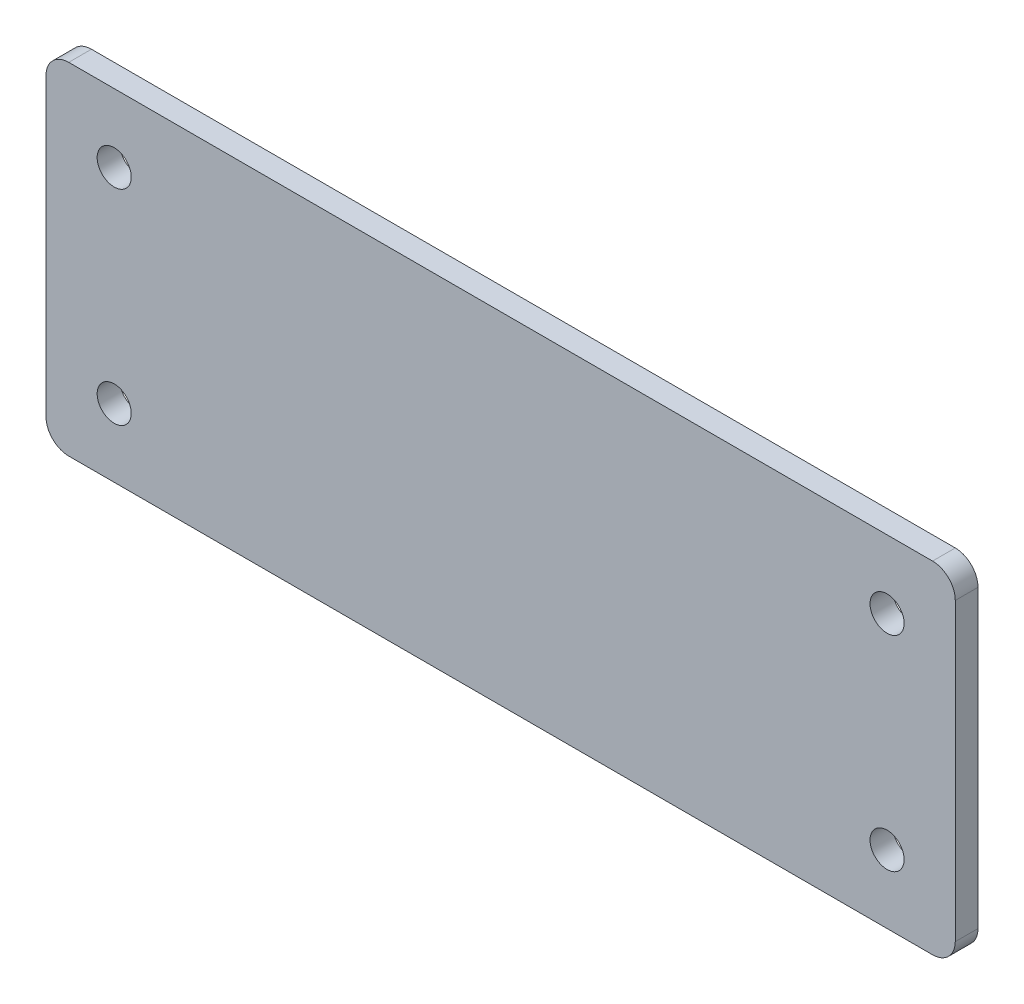
ISO-10303-21;
HEADER;
FILE_DESCRIPTION(('STEP AP214'),'2;1');
FILE_NAME('part.step','',(''),(''),'','','');
FILE_SCHEMA(('AUTOMOTIVE_DESIGN { 1 0 10303 214 1 1 1 1 }'));
ENDSEC;
DATA;
#1=APPLICATION_CONTEXT('core data for automotive mechanical design processes');
#2=APPLICATION_PROTOCOL_DEFINITION('international standard','automotive_design',2000,#1);
#3=PRODUCT_CONTEXT('',#1,'mechanical');
#4=PRODUCT('Part','Part','',(#3));
#5=PRODUCT_RELATED_PRODUCT_CATEGORY('part','',(#4));
#6=PRODUCT_DEFINITION_FORMATION('','',#4);
#7=PRODUCT_DEFINITION_CONTEXT('part definition',#1,'design');
#8=PRODUCT_DEFINITION('design','',#6,#7);
#9=PRODUCT_DEFINITION_SHAPE('','',#8);
#10=(LENGTH_UNIT() NAMED_UNIT(*) SI_UNIT(.MILLI.,.METRE.));
#11=(NAMED_UNIT(*) PLANE_ANGLE_UNIT() SI_UNIT($,.RADIAN.));
#12=(NAMED_UNIT(*) SI_UNIT($,.STERADIAN.) SOLID_ANGLE_UNIT());
#13=UNCERTAINTY_MEASURE_WITH_UNIT(LENGTH_MEASURE(1.E-05),#10,'distance_accuracy_value','');
#14=(GEOMETRIC_REPRESENTATION_CONTEXT(3) GLOBAL_UNCERTAINTY_ASSIGNED_CONTEXT((#13)) GLOBAL_UNIT_ASSIGNED_CONTEXT((#10,
#11,#12)) REPRESENTATION_CONTEXT('',''));
#15=CARTESIAN_POINT('',(0.,0.,0.));
#16=DIRECTION('',(0.,0.,1.));
#17=DIRECTION('',(1.,0.,0.));
#18=AXIS2_PLACEMENT_3D('',#15,#16,#17);
#19=CARTESIAN_POINT('',(200.,-75.,5.));
#20=DIRECTION('',(-1.,0.,0.));
#21=DIRECTION('',(0.,0.,1.));
#22=AXIS2_PLACEMENT_3D('',#19,#20,#21);
#23=PLANE('',#22);
#24=DIRECTION('',(0.,1.,0.));
#25=VECTOR('',#24,1.);
#26=CARTESIAN_POINT('',(200.,-75.,-5.));
#27=LINE('',#26,#25);
#28=CARTESIAN_POINT('',(200.,-65.,-5.));
#29=VERTEX_POINT('',#28);
#30=CARTESIAN_POINT('',(200.,65.,-5.));
#31=VERTEX_POINT('',#30);
#32=EDGE_CURVE('E147',#29,#31,#27,.T.);
#33=ORIENTED_EDGE('',*,*,#32,.T.);
#34=DIRECTION('',(0.,0.,-1.));
#35=VECTOR('',#34,1.);
#36=CARTESIAN_POINT('',(200.,65.,5.));
#37=LINE('',#36,#35);
#38=CARTESIAN_POINT('',(200.,65.,5.));
#39=VERTEX_POINT('',#38);
#40=EDGE_CURVE('E181',#31,#39,#37,.F.);
#41=ORIENTED_EDGE('',*,*,#40,.T.);
#42=DIRECTION('',(0.,1.,0.));
#43=VECTOR('',#42,1.);
#44=CARTESIAN_POINT('',(200.,-75.,5.));
#45=LINE('',#44,#43);
#46=CARTESIAN_POINT('',(200.,-65.,5.));
#47=VERTEX_POINT('',#46);
#48=EDGE_CURVE('E145',#47,#39,#45,.T.);
#49=ORIENTED_EDGE('',*,*,#48,.F.);
#50=DIRECTION('',(0.,0.,-1.));
#51=VECTOR('',#50,1.);
#52=CARTESIAN_POINT('',(200.,-65.,5.));
#53=LINE('',#52,#51);
#54=EDGE_CURVE('E177',#47,#29,#53,.T.);
#55=ORIENTED_EDGE('',*,*,#54,.T.);
#56=EDGE_LOOP('',(#33,#41,#49,#55));
#57=FACE_BOUND('',#56,.T.);
#58=ADVANCED_FACE('F45',(#57),#23,.F.);
#59=CARTESIAN_POINT('',(-200.,75.,5.));
#60=DIRECTION('',(0.,-1.,0.));
#61=DIRECTION('',(0.,0.,-1.));
#62=AXIS2_PLACEMENT_3D('',#59,#60,#61);
#63=PLANE('',#62);
#64=DIRECTION('',(-1.,0.,0.));
#65=VECTOR('',#64,1.);
#66=CARTESIAN_POINT('',(-200.,75.,-5.));
#67=LINE('',#66,#65);
#68=CARTESIAN_POINT('',(190.,75.,-5.));
#69=VERTEX_POINT('',#68);
#70=CARTESIAN_POINT('',(-190.,75.,-5.));
#71=VERTEX_POINT('',#70);
#72=EDGE_CURVE('E140',#69,#71,#67,.T.);
#73=ORIENTED_EDGE('',*,*,#72,.T.);
#74=DIRECTION('',(0.,0.,-1.));
#75=VECTOR('',#74,1.);
#76=CARTESIAN_POINT('',(-190.,75.,5.));
#77=LINE('',#76,#75);
#78=CARTESIAN_POINT('',(-190.,75.,5.));
#79=VERTEX_POINT('',#78);
#80=EDGE_CURVE('E116',#71,#79,#77,.F.);
#81=ORIENTED_EDGE('',*,*,#80,.T.);
#82=DIRECTION('',(-1.,0.,0.));
#83=VECTOR('',#82,1.);
#84=CARTESIAN_POINT('',(-200.,75.,5.));
#85=LINE('',#84,#83);
#86=CARTESIAN_POINT('',(190.,75.,5.));
#87=VERTEX_POINT('',#86);
#88=EDGE_CURVE('E201',#87,#79,#85,.T.);
#89=ORIENTED_EDGE('',*,*,#88,.F.);
#90=DIRECTION('',(0.,0.,-1.));
#91=VECTOR('',#90,1.);
#92=CARTESIAN_POINT('',(190.,75.,5.));
#93=LINE('',#92,#91);
#94=EDGE_CURVE('E122',#87,#69,#93,.T.);
#95=ORIENTED_EDGE('',*,*,#94,.T.);
#96=EDGE_LOOP('',(#73,#81,#89,#95));
#97=FACE_BOUND('',#96,.T.);
#98=ADVANCED_FACE('F269',(#97),#63,.F.);
#99=CARTESIAN_POINT('',(-200.,-75.,5.));
#100=DIRECTION('',(1.,0.,0.));
#101=DIRECTION('',(0.,0.,-1.));
#102=AXIS2_PLACEMENT_3D('',#99,#100,#101);
#103=PLANE('',#102);
#104=DIRECTION('',(0.,-1.,0.));
#105=VECTOR('',#104,1.);
#106=CARTESIAN_POINT('',(-200.,-75.,5.));
#107=LINE('',#106,#105);
#108=CARTESIAN_POINT('',(-200.,65.,5.));
#109=VERTEX_POINT('',#108);
#110=CARTESIAN_POINT('',(-200.,-65.,5.));
#111=VERTEX_POINT('',#110);
#112=EDGE_CURVE('E131',#109,#111,#107,.T.);
#113=ORIENTED_EDGE('',*,*,#112,.F.);
#114=DIRECTION('',(0.,0.,-1.));
#115=VECTOR('',#114,1.);
#116=CARTESIAN_POINT('',(-200.,65.,5.));
#117=LINE('',#116,#115);
#118=CARTESIAN_POINT('',(-200.,65.,-5.));
#119=VERTEX_POINT('',#118);
#120=EDGE_CURVE('E115',#109,#119,#117,.T.);
#121=ORIENTED_EDGE('',*,*,#120,.T.);
#122=DIRECTION('',(0.,-1.,0.));
#123=VECTOR('',#122,1.);
#124=CARTESIAN_POINT('',(-200.,-75.,-5.));
#125=LINE('',#124,#123);
#126=CARTESIAN_POINT('',(-200.,-65.,-5.));
#127=VERTEX_POINT('',#126);
#128=EDGE_CURVE('E129',#119,#127,#125,.T.);
#129=ORIENTED_EDGE('',*,*,#128,.T.);
#130=DIRECTION('',(0.,0.,-1.));
#131=VECTOR('',#130,1.);
#132=CARTESIAN_POINT('',(-200.,-65.,5.));
#133=LINE('',#132,#131);
#134=EDGE_CURVE('E134',#127,#111,#133,.F.);
#135=ORIENTED_EDGE('',*,*,#134,.T.);
#136=EDGE_LOOP('',(#113,#121,#129,#135));
#137=FACE_BOUND('',#136,.T.);
#138=ADVANCED_FACE('F128',(#137),#103,.F.);
#139=CARTESIAN_POINT('',(-200.,-75.,5.));
#140=DIRECTION('',(0.,1.,0.));
#141=DIRECTION('',(0.,0.,1.));
#142=AXIS2_PLACEMENT_3D('',#139,#140,#141);
#143=PLANE('',#142);
#144=DIRECTION('',(1.,0.,0.));
#145=VECTOR('',#144,1.);
#146=CARTESIAN_POINT('',(-200.,-75.,-5.));
#147=LINE('',#146,#145);
#148=CARTESIAN_POINT('',(-190.,-75.,-5.));
#149=VERTEX_POINT('',#148);
#150=CARTESIAN_POINT('',(190.,-75.,-5.));
#151=VERTEX_POINT('',#150);
#152=EDGE_CURVE('E139',#149,#151,#147,.T.);
#153=ORIENTED_EDGE('',*,*,#152,.T.);
#154=DIRECTION('',(0.,0.,-1.));
#155=VECTOR('',#154,1.);
#156=CARTESIAN_POINT('',(190.,-75.,5.));
#157=LINE('',#156,#155);
#158=CARTESIAN_POINT('',(190.,-75.,5.));
#159=VERTEX_POINT('',#158);
#160=EDGE_CURVE('E11',#151,#159,#157,.F.);
#161=ORIENTED_EDGE('',*,*,#160,.T.);
#162=DIRECTION('',(1.,0.,0.));
#163=VECTOR('',#162,1.);
#164=CARTESIAN_POINT('',(-200.,-75.,5.));
#165=LINE('',#164,#163);
#166=CARTESIAN_POINT('',(-190.,-75.,5.));
#167=VERTEX_POINT('',#166);
#168=EDGE_CURVE('E152',#167,#159,#165,.T.);
#169=ORIENTED_EDGE('',*,*,#168,.F.);
#170=DIRECTION('',(0.,0.,-1.));
#171=VECTOR('',#170,1.);
#172=CARTESIAN_POINT('',(-190.,-75.,5.));
#173=LINE('',#172,#171);
#174=EDGE_CURVE('E54',#167,#149,#173,.T.);
#175=ORIENTED_EDGE('',*,*,#174,.T.);
#176=EDGE_LOOP('',(#153,#161,#169,#175));
#177=FACE_BOUND('',#176,.T.);
#178=ADVANCED_FACE('F187',(#177),#143,.F.);
#179=CARTESIAN_POINT('',(0.,0.,5.));
#180=DIRECTION('',(0.,0.,-1.));
#181=DIRECTION('',(-1.,0.,0.));
#182=AXIS2_PLACEMENT_3D('',#179,#180,#181);
#183=PLANE('',#182);
#184=CARTESIAN_POINT('',(170.,45.,5.));
#185=DIRECTION('',(0.,0.,1.));
#186=DIRECTION('',(-1.,0.,0.));
#187=AXIS2_PLACEMENT_3D('',#184,#185,#186);
#188=CIRCLE('',#187,7.50000000000001);
#189=CARTESIAN_POINT('',(162.5,45.,5.));
#190=VERTEX_POINT('',#189);
#191=EDGE_CURVE('E226',#190,#190,#188,.T.);
#192=ORIENTED_EDGE('',*,*,#191,.F.);
#193=EDGE_LOOP('',(#192));
#194=FACE_BOUND('',#193,.T.);
#195=CARTESIAN_POINT('',(170.,-45.,5.));
#196=DIRECTION('',(0.,0.,1.));
#197=DIRECTION('',(1.,0.,0.));
#198=AXIS2_PLACEMENT_3D('',#195,#196,#197);
#199=CIRCLE('',#198,7.50000000000001);
#200=CARTESIAN_POINT('',(177.5,-45.,5.));
#201=VERTEX_POINT('',#200);
#202=EDGE_CURVE('E234',#201,#201,#199,.T.);
#203=ORIENTED_EDGE('',*,*,#202,.F.);
#204=EDGE_LOOP('',(#203));
#205=FACE_BOUND('',#204,.T.);
#206=CARTESIAN_POINT('',(-170.,-45.,5.));
#207=DIRECTION('',(0.,0.,1.));
#208=DIRECTION('',(-1.,0.,0.));
#209=AXIS2_PLACEMENT_3D('',#206,#207,#208);
#210=CIRCLE('',#209,7.50000000000001);
#211=CARTESIAN_POINT('',(-177.5,-45.,5.));
#212=VERTEX_POINT('',#211);
#213=EDGE_CURVE('E242',#212,#212,#210,.T.);
#214=ORIENTED_EDGE('',*,*,#213,.F.);
#215=EDGE_LOOP('',(#214));
#216=FACE_BOUND('',#215,.T.);
#217=CARTESIAN_POINT('',(-170.,45.,5.));
#218=DIRECTION('',(0.,0.,1.));
#219=DIRECTION('',(1.,0.,0.));
#220=AXIS2_PLACEMENT_3D('',#217,#218,#219);
#221=CIRCLE('',#220,7.50000000000001);
#222=CARTESIAN_POINT('',(-162.5,45.,5.));
#223=VERTEX_POINT('',#222);
#224=EDGE_CURVE('E208',#223,#223,#221,.T.);
#225=ORIENTED_EDGE('',*,*,#224,.F.);
#226=EDGE_LOOP('',(#225));
#227=FACE_BOUND('',#226,.T.);
#228=ORIENTED_EDGE('',*,*,#88,.T.);
#229=CARTESIAN_POINT('',(-190.,65.,5.));
#230=DIRECTION('',(0.,0.,-1.));
#231=DIRECTION('',(-1.,0.,0.));
#232=AXIS2_PLACEMENT_3D('',#229,#230,#231);
#233=CIRCLE('',#232,10.);
#234=EDGE_CURVE('E174',#79,#109,#233,.F.);
#235=ORIENTED_EDGE('',*,*,#234,.T.);
#236=ORIENTED_EDGE('',*,*,#112,.T.);
#237=CARTESIAN_POINT('',(-190.,-65.,5.));
#238=DIRECTION('',(0.,0.,-1.));
#239=DIRECTION('',(-1.,0.,0.));
#240=AXIS2_PLACEMENT_3D('',#237,#238,#239);
#241=CIRCLE('',#240,10.);
#242=EDGE_CURVE('E66',#111,#167,#241,.F.);
#243=ORIENTED_EDGE('',*,*,#242,.T.);
#244=ORIENTED_EDGE('',*,*,#168,.T.);
#245=CARTESIAN_POINT('',(190.,-65.,5.));
#246=DIRECTION('',(0.,0.,-1.));
#247=DIRECTION('',(-1.,0.,0.));
#248=AXIS2_PLACEMENT_3D('',#245,#246,#247);
#249=CIRCLE('',#248,10.);
#250=EDGE_CURVE('E168',#159,#47,#249,.F.);
#251=ORIENTED_EDGE('',*,*,#250,.T.);
#252=ORIENTED_EDGE('',*,*,#48,.T.);
#253=CARTESIAN_POINT('',(190.,65.,5.));
#254=DIRECTION('',(0.,0.,-1.));
#255=DIRECTION('',(-1.,0.,0.));
#256=AXIS2_PLACEMENT_3D('',#253,#254,#255);
#257=CIRCLE('',#256,10.);
#258=EDGE_CURVE('E171',#39,#87,#257,.F.);
#259=ORIENTED_EDGE('',*,*,#258,.T.);
#260=EDGE_LOOP('',(#228,#235,#236,#243,#244,#251,#252,#259));
#261=FACE_BOUND('',#260,.T.);
#262=ADVANCED_FACE('F260',(#194,#205,#216,#227,#261),#183,.F.);
#263=CARTESIAN_POINT('',(0.,0.,-5.));
#264=DIRECTION('',(0.,0.,-1.));
#265=DIRECTION('',(-1.,0.,0.));
#266=AXIS2_PLACEMENT_3D('',#263,#264,#265);
#267=PLANE('',#266);
#268=CARTESIAN_POINT('',(170.,45.,-5.));
#269=DIRECTION('',(0.,0.,1.));
#270=DIRECTION('',(-1.,0.,0.));
#271=AXIS2_PLACEMENT_3D('',#268,#269,#270);
#272=CIRCLE('',#271,7.50000000000001);
#273=CARTESIAN_POINT('',(162.5,45.,-5.));
#274=VERTEX_POINT('',#273);
#275=EDGE_CURVE('E230',#274,#274,#272,.T.);
#276=ORIENTED_EDGE('',*,*,#275,.T.);
#277=EDGE_LOOP('',(#276));
#278=FACE_BOUND('',#277,.T.);
#279=CARTESIAN_POINT('',(170.,-45.,-5.));
#280=DIRECTION('',(0.,0.,1.));
#281=DIRECTION('',(1.,0.,0.));
#282=AXIS2_PLACEMENT_3D('',#279,#280,#281);
#283=CIRCLE('',#282,7.50000000000001);
#284=CARTESIAN_POINT('',(177.5,-45.,-5.));
#285=VERTEX_POINT('',#284);
#286=EDGE_CURVE('E238',#285,#285,#283,.T.);
#287=ORIENTED_EDGE('',*,*,#286,.T.);
#288=EDGE_LOOP('',(#287));
#289=FACE_BOUND('',#288,.T.);
#290=CARTESIAN_POINT('',(-170.,-45.,-5.));
#291=DIRECTION('',(0.,0.,1.));
#292=DIRECTION('',(-1.,0.,0.));
#293=AXIS2_PLACEMENT_3D('',#290,#291,#292);
#294=CIRCLE('',#293,7.50000000000001);
#295=CARTESIAN_POINT('',(-177.5,-45.,-5.));
#296=VERTEX_POINT('',#295);
#297=EDGE_CURVE('E224',#296,#296,#294,.T.);
#298=ORIENTED_EDGE('',*,*,#297,.T.);
#299=EDGE_LOOP('',(#298));
#300=FACE_BOUND('',#299,.T.);
#301=CARTESIAN_POINT('',(-170.,45.,-5.));
#302=DIRECTION('',(0.,0.,1.));
#303=DIRECTION('',(1.,0.,0.));
#304=AXIS2_PLACEMENT_3D('',#301,#302,#303);
#305=CIRCLE('',#304,7.50000000000001);
#306=CARTESIAN_POINT('',(-162.5,45.,-5.));
#307=VERTEX_POINT('',#306);
#308=EDGE_CURVE('E215',#307,#307,#305,.T.);
#309=ORIENTED_EDGE('',*,*,#308,.T.);
#310=EDGE_LOOP('',(#309));
#311=FACE_BOUND('',#310,.T.);
#312=ORIENTED_EDGE('',*,*,#128,.F.);
#313=CARTESIAN_POINT('',(-190.,65.,-5.));
#314=DIRECTION('',(0.,0.,-1.));
#315=DIRECTION('',(-1.,0.,0.));
#316=AXIS2_PLACEMENT_3D('',#313,#314,#315);
#317=CIRCLE('',#316,10.);
#318=EDGE_CURVE('E111',#119,#71,#317,.T.);
#319=ORIENTED_EDGE('',*,*,#318,.T.);
#320=ORIENTED_EDGE('',*,*,#72,.F.);
#321=CARTESIAN_POINT('',(190.,65.,-5.));
#322=DIRECTION('',(0.,0.,-1.));
#323=DIRECTION('',(-1.,0.,0.));
#324=AXIS2_PLACEMENT_3D('',#321,#322,#323);
#325=CIRCLE('',#324,10.);
#326=EDGE_CURVE('E123',#69,#31,#325,.T.);
#327=ORIENTED_EDGE('',*,*,#326,.T.);
#328=ORIENTED_EDGE('',*,*,#32,.F.);
#329=CARTESIAN_POINT('',(190.,-65.,-5.));
#330=DIRECTION('',(0.,0.,-1.));
#331=DIRECTION('',(-1.,0.,0.));
#332=AXIS2_PLACEMENT_3D('',#329,#330,#331);
#333=CIRCLE('',#332,10.);
#334=EDGE_CURVE('E156',#29,#151,#333,.T.);
#335=ORIENTED_EDGE('',*,*,#334,.T.);
#336=ORIENTED_EDGE('',*,*,#152,.F.);
#337=CARTESIAN_POINT('',(-190.,-65.,-5.));
#338=DIRECTION('',(0.,0.,-1.));
#339=DIRECTION('',(-1.,0.,0.));
#340=AXIS2_PLACEMENT_3D('',#337,#338,#339);
#341=CIRCLE('',#340,10.);
#342=EDGE_CURVE('E133',#149,#127,#341,.T.);
#343=ORIENTED_EDGE('',*,*,#342,.T.);
#344=EDGE_LOOP('',(#312,#319,#320,#327,#328,#335,#336,#343));
#345=FACE_BOUND('',#344,.T.);
#346=ADVANCED_FACE('F136',(#278,#289,#300,#311,#345),#267,.T.);
#347=CARTESIAN_POINT('',(-170.,45.,-5.));
#348=DIRECTION('',(0.,0.,1.));
#349=DIRECTION('',(1.,0.,0.));
#350=AXIS2_PLACEMENT_3D('',#347,#348,#349);
#351=CYLINDRICAL_SURFACE('',#350,7.50000000000001);
#352=ORIENTED_EDGE('',*,*,#308,.F.);
#353=EDGE_LOOP('',(#352));
#354=FACE_BOUND('',#353,.T.);
#355=ORIENTED_EDGE('',*,*,#224,.T.);
#356=EDGE_LOOP('',(#355));
#357=FACE_BOUND('',#356,.T.);
#358=ADVANCED_FACE('F256',(#354,#357),#351,.F.);
#359=CARTESIAN_POINT('',(-170.,-45.,-5.));
#360=DIRECTION('',(0.,0.,1.));
#361=DIRECTION('',(1.,0.,0.));
#362=AXIS2_PLACEMENT_3D('',#359,#360,#361);
#363=CYLINDRICAL_SURFACE('',#362,7.50000000000001);
#364=ORIENTED_EDGE('',*,*,#297,.F.);
#365=EDGE_LOOP('',(#364));
#366=FACE_BOUND('',#365,.T.);
#367=ORIENTED_EDGE('',*,*,#213,.T.);
#368=EDGE_LOOP('',(#367));
#369=FACE_BOUND('',#368,.T.);
#370=ADVANCED_FACE('F252',(#366,#369),#363,.F.);
#371=CARTESIAN_POINT('',(170.,-45.,-5.));
#372=DIRECTION('',(0.,0.,1.));
#373=DIRECTION('',(1.,0.,0.));
#374=AXIS2_PLACEMENT_3D('',#371,#372,#373);
#375=CYLINDRICAL_SURFACE('',#374,7.50000000000001);
#376=ORIENTED_EDGE('',*,*,#286,.F.);
#377=EDGE_LOOP('',(#376));
#378=FACE_BOUND('',#377,.T.);
#379=ORIENTED_EDGE('',*,*,#202,.T.);
#380=EDGE_LOOP('',(#379));
#381=FACE_BOUND('',#380,.T.);
#382=ADVANCED_FACE('F255',(#378,#381),#375,.F.);
#383=CARTESIAN_POINT('',(170.,45.,-5.));
#384=DIRECTION('',(0.,0.,1.));
#385=DIRECTION('',(1.,0.,0.));
#386=AXIS2_PLACEMENT_3D('',#383,#384,#385);
#387=CYLINDRICAL_SURFACE('',#386,7.50000000000001);
#388=ORIENTED_EDGE('',*,*,#275,.F.);
#389=EDGE_LOOP('',(#388));
#390=FACE_BOUND('',#389,.T.);
#391=ORIENTED_EDGE('',*,*,#191,.T.);
#392=EDGE_LOOP('',(#391));
#393=FACE_BOUND('',#392,.T.);
#394=ADVANCED_FACE('F278',(#390,#393),#387,.F.);
#395=CARTESIAN_POINT('',(-190.,65.,5.));
#396=DIRECTION('',(0.,0.,-1.));
#397=DIRECTION('',(-1.,0.,0.));
#398=AXIS2_PLACEMENT_3D('',#395,#396,#397);
#399=CYLINDRICAL_SURFACE('',#398,10.);
#400=ORIENTED_EDGE('',*,*,#234,.F.);
#401=ORIENTED_EDGE('',*,*,#80,.F.);
#402=ORIENTED_EDGE('',*,*,#318,.F.);
#403=ORIENTED_EDGE('',*,*,#120,.F.);
#404=EDGE_LOOP('',(#400,#401,#402,#403));
#405=FACE_BOUND('',#404,.T.);
#406=ADVANCED_FACE('F114',(#405),#399,.T.);
#407=CARTESIAN_POINT('',(190.,65.,5.));
#408=DIRECTION('',(0.,0.,-1.));
#409=DIRECTION('',(-1.,0.,0.));
#410=AXIS2_PLACEMENT_3D('',#407,#408,#409);
#411=CYLINDRICAL_SURFACE('',#410,10.);
#412=ORIENTED_EDGE('',*,*,#258,.F.);
#413=ORIENTED_EDGE('',*,*,#40,.F.);
#414=ORIENTED_EDGE('',*,*,#326,.F.);
#415=ORIENTED_EDGE('',*,*,#94,.F.);
#416=EDGE_LOOP('',(#412,#413,#414,#415));
#417=FACE_BOUND('',#416,.T.);
#418=ADVANCED_FACE('F271',(#417),#411,.T.);
#419=CARTESIAN_POINT('',(190.,-65.,5.));
#420=DIRECTION('',(0.,0.,-1.));
#421=DIRECTION('',(-1.,0.,0.));
#422=AXIS2_PLACEMENT_3D('',#419,#420,#421);
#423=CYLINDRICAL_SURFACE('',#422,10.);
#424=ORIENTED_EDGE('',*,*,#250,.F.);
#425=ORIENTED_EDGE('',*,*,#160,.F.);
#426=ORIENTED_EDGE('',*,*,#334,.F.);
#427=ORIENTED_EDGE('',*,*,#54,.F.);
#428=EDGE_LOOP('',(#424,#425,#426,#427));
#429=FACE_BOUND('',#428,.T.);
#430=ADVANCED_FACE('F194',(#429),#423,.T.);
#431=CARTESIAN_POINT('',(-190.,-65.,5.));
#432=DIRECTION('',(0.,0.,-1.));
#433=DIRECTION('',(-1.,0.,0.));
#434=AXIS2_PLACEMENT_3D('',#431,#432,#433);
#435=CYLINDRICAL_SURFACE('',#434,10.);
#436=ORIENTED_EDGE('',*,*,#242,.F.);
#437=ORIENTED_EDGE('',*,*,#134,.F.);
#438=ORIENTED_EDGE('',*,*,#342,.F.);
#439=ORIENTED_EDGE('',*,*,#174,.F.);
#440=EDGE_LOOP('',(#436,#437,#438,#439));
#441=FACE_BOUND('',#440,.T.);
#442=ADVANCED_FACE('F47',(#441),#435,.T.);
#443=CLOSED_SHELL('',(#58,#98,#138,#178,#262,#346,#358,#370,#382,#394,#406,#418,#430,#442));
#444=MANIFOLD_SOLID_BREP('B2',#443);
#445=ADVANCED_BREP_SHAPE_REPRESENTATION('',(#18,#444),#14);
#446=SHAPE_DEFINITION_REPRESENTATION(#9,#445);
ENDSEC;
END-ISO-10303-21;
